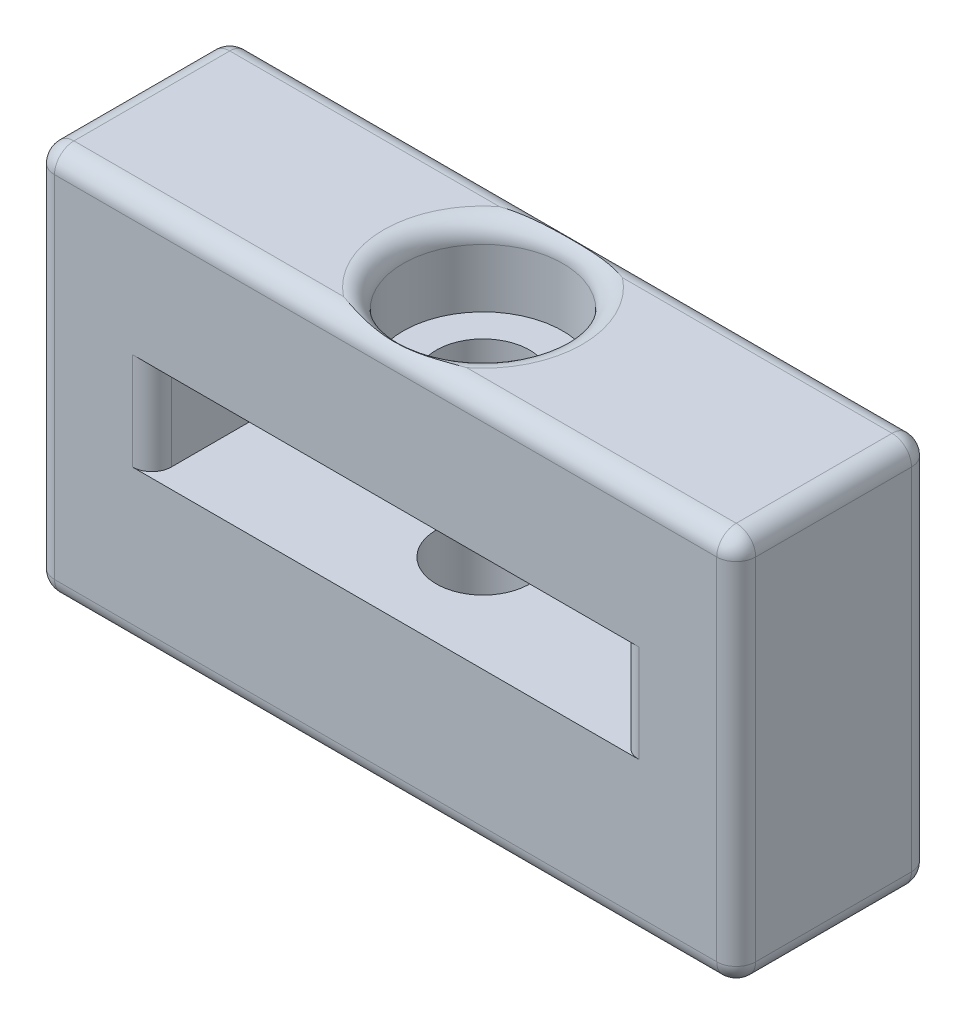
ISO-10303-21;
HEADER;
FILE_DESCRIPTION(('STEP AP214'),'2;1');
FILE_NAME('part.step','',(''),(''),'','','');
FILE_SCHEMA(('AUTOMOTIVE_DESIGN { 1 0 10303 214 1 1 1 1 }'));
ENDSEC;
DATA;
#1=APPLICATION_CONTEXT('core data for automotive mechanical design processes');
#2=APPLICATION_PROTOCOL_DEFINITION('international standard','automotive_design',2000,#1);
#3=PRODUCT_CONTEXT('',#1,'mechanical');
#4=PRODUCT('Part','Part','',(#3));
#5=PRODUCT_RELATED_PRODUCT_CATEGORY('part','',(#4));
#6=PRODUCT_DEFINITION_FORMATION('','',#4);
#7=PRODUCT_DEFINITION_CONTEXT('part definition',#1,'design');
#8=PRODUCT_DEFINITION('design','',#6,#7);
#9=PRODUCT_DEFINITION_SHAPE('','',#8);
#10=(LENGTH_UNIT() NAMED_UNIT(*) SI_UNIT(.MILLI.,.METRE.));
#11=(NAMED_UNIT(*) PLANE_ANGLE_UNIT() SI_UNIT($,.RADIAN.));
#12=(NAMED_UNIT(*) SI_UNIT($,.STERADIAN.) SOLID_ANGLE_UNIT());
#13=UNCERTAINTY_MEASURE_WITH_UNIT(LENGTH_MEASURE(1.E-05),#10,'distance_accuracy_value','');
#14=(GEOMETRIC_REPRESENTATION_CONTEXT(3) GLOBAL_UNCERTAINTY_ASSIGNED_CONTEXT((#13)) GLOBAL_UNIT_ASSIGNED_CONTEXT((#10,
#11,#12)) REPRESENTATION_CONTEXT('',''));
#15=CARTESIAN_POINT('',(0.,0.,0.));
#16=DIRECTION('',(0.,0.,1.));
#17=DIRECTION('',(1.,0.,0.));
#18=AXIS2_PLACEMENT_3D('',#15,#16,#17);
#19=CARTESIAN_POINT('',(0.,10.,0.));
#20=DIRECTION('',(0.,1.,0.));
#21=DIRECTION('',(0.,0.,1.));
#22=AXIS2_PLACEMENT_3D('',#19,#20,#21);
#23=PLANE('',#22);
#24=DIRECTION('',(1.,0.,0.));
#25=VECTOR('',#24,1.);
#26=CARTESIAN_POINT('',(9.,10.,2.));
#27=LINE('',#26,#25);
#28=CARTESIAN_POINT('',(1.58192920195563,10.,2.));
#29=VERTEX_POINT('',#28);
#30=CARTESIAN_POINT('',(8.5,10.,2.));
#31=VERTEX_POINT('',#30);
#32=EDGE_CURVE('E327',#29,#31,#27,.T.);
#33=ORIENTED_EDGE('',*,*,#32,.T.);
#34=DIRECTION('',(0.,0.,-1.));
#35=VECTOR('',#34,1.);
#36=CARTESIAN_POINT('',(8.5,10.,0.));
#37=LINE('',#36,#35);
#38=CARTESIAN_POINT('',(8.5,10.,-2.));
#39=VERTEX_POINT('',#38);
#40=EDGE_CURVE('E330',#31,#39,#37,.T.);
#41=ORIENTED_EDGE('',*,*,#40,.T.);
#42=DIRECTION('',(-1.,0.,0.));
#43=VECTOR('',#42,1.);
#44=CARTESIAN_POINT('',(-9.,10.,-2.));
#45=LINE('',#44,#43);
#46=CARTESIAN_POINT('',(1.58192920195563,10.,-2.));
#47=VERTEX_POINT('',#46);
#48=EDGE_CURVE('E324',#39,#47,#45,.T.);
#49=ORIENTED_EDGE('',*,*,#48,.T.);
#50=CARTESIAN_POINT('',(0.,10.,0.));
#51=DIRECTION('',(0.,1.,0.));
#52=DIRECTION('',(0.,0.,1.));
#53=AXIS2_PLACEMENT_3D('',#50,#51,#52);
#54=CIRCLE('',#53,2.55);
#55=EDGE_CURVE('E321',#47,#29,#54,.F.);
#56=ORIENTED_EDGE('',*,*,#55,.T.);
#57=EDGE_LOOP('',(#33,#41,#49,#56));
#58=FACE_BOUND('',#57,.T.);
#59=ADVANCED_FACE('F45',(#58),#23,.T.);
#60=CARTESIAN_POINT('',(0.,-3.39411254969543,0.));
#61=DIRECTION('',(0.,1.,0.));
#62=DIRECTION('',(0.,0.,1.));
#63=AXIS2_PLACEMENT_3D('',#60,#61,#62);
#64=CYLINDRICAL_SURFACE('',#63,1.2);
#65=CARTESIAN_POINT('',(0.,6.5,0.));
#66=DIRECTION('',(0.,1.,0.));
#67=DIRECTION('',(0.,0.,1.));
#68=AXIS2_PLACEMENT_3D('',#65,#66,#67);
#69=CIRCLE('',#68,1.2);
#70=CARTESIAN_POINT('',(0.,6.5,1.2));
#71=VERTEX_POINT('',#70);
#72=EDGE_CURVE('E502',#71,#71,#69,.T.);
#73=ORIENTED_EDGE('',*,*,#72,.F.);
#74=EDGE_LOOP('',(#73));
#75=FACE_BOUND('',#74,.T.);
#76=CARTESIAN_POINT('',(0.,8.,0.));
#77=DIRECTION('',(0.,1.,0.));
#78=DIRECTION('',(0.,0.,1.));
#79=AXIS2_PLACEMENT_3D('',#76,#77,#78);
#80=CIRCLE('',#79,1.2);
#81=CARTESIAN_POINT('',(0.,8.,1.2));
#82=VERTEX_POINT('',#81);
#83=EDGE_CURVE('E490',#82,#82,#80,.F.);
#84=ORIENTED_EDGE('',*,*,#83,.F.);
#85=EDGE_LOOP('',(#84));
#86=FACE_BOUND('',#85,.T.);
#87=ADVANCED_FACE('F541',(#75,#86),#64,.F.);
#88=CARTESIAN_POINT('',(-6.,4.,-2.5));
#89=DIRECTION('',(0.,0.,1.));
#90=DIRECTION('',(1.,0.,0.));
#91=AXIS2_PLACEMENT_3D('',#88,#89,#90);
#92=PLANE('',#91);
#93=DIRECTION('',(0.,1.,0.));
#94=VECTOR('',#93,1.);
#95=CARTESIAN_POINT('',(-8.5,10.,-2.5));
#96=LINE('',#95,#94);
#97=CARTESIAN_POINT('',(-8.5,0.5,-2.5));
#98=VERTEX_POINT('',#97);
#99=CARTESIAN_POINT('',(-8.5,9.5,-2.5));
#100=VERTEX_POINT('',#99);
#101=EDGE_CURVE('E228',#98,#100,#96,.T.);
#102=ORIENTED_EDGE('',*,*,#101,.T.);
#103=DIRECTION('',(-1.,0.,0.));
#104=VECTOR('',#103,1.);
#105=CARTESIAN_POINT('',(9.,9.5,-2.5));
#106=LINE('',#105,#104);
#107=CARTESIAN_POINT('',(8.5,9.5,-2.5));
#108=VERTEX_POINT('',#107);
#109=EDGE_CURVE('E234',#100,#108,#106,.F.);
#110=ORIENTED_EDGE('',*,*,#109,.T.);
#111=DIRECTION('',(0.,-1.,0.));
#112=VECTOR('',#111,1.);
#113=CARTESIAN_POINT('',(8.5,0.,-2.5));
#114=LINE('',#113,#112);
#115=CARTESIAN_POINT('',(8.5,0.5,-2.5));
#116=VERTEX_POINT('',#115);
#117=EDGE_CURVE('E202',#108,#116,#114,.T.);
#118=ORIENTED_EDGE('',*,*,#117,.T.);
#119=DIRECTION('',(-1.,0.,0.));
#120=VECTOR('',#119,1.);
#121=CARTESIAN_POINT('',(-9.,0.5,-2.5));
#122=LINE('',#121,#120);
#123=EDGE_CURVE('E221',#116,#98,#122,.T.);
#124=ORIENTED_EDGE('',*,*,#123,.T.);
#125=EDGE_LOOP('',(#102,#110,#118,#124));
#126=FACE_BOUND('',#125,.T.);
#127=DIRECTION('',(0.,1.,0.));
#128=VECTOR('',#127,1.);
#129=CARTESIAN_POINT('',(6.5,6.5,-2.5));
#130=LINE('',#129,#128);
#131=CARTESIAN_POINT('',(6.5,4.,-2.5));
#132=VERTEX_POINT('',#131);
#133=CARTESIAN_POINT('',(6.5,6.5,-2.5));
#134=VERTEX_POINT('',#133);
#135=EDGE_CURVE('E247',#132,#134,#130,.T.);
#136=ORIENTED_EDGE('',*,*,#135,.T.);
#137=DIRECTION('',(-1.,0.,0.));
#138=VECTOR('',#137,1.);
#139=CARTESIAN_POINT('',(-9.,6.5,-2.5));
#140=LINE('',#139,#138);
#141=CARTESIAN_POINT('',(-6.5,6.5,-2.5));
#142=VERTEX_POINT('',#141);
#143=EDGE_CURVE('E510',#134,#142,#140,.T.);
#144=ORIENTED_EDGE('',*,*,#143,.T.);
#145=DIRECTION('',(0.,-1.,0.));
#146=VECTOR('',#145,1.);
#147=CARTESIAN_POINT('',(-6.5,4.,-2.5));
#148=LINE('',#147,#146);
#149=CARTESIAN_POINT('',(-6.5,4.,-2.5));
#150=VERTEX_POINT('',#149);
#151=EDGE_CURVE('E240',#142,#150,#148,.T.);
#152=ORIENTED_EDGE('',*,*,#151,.T.);
#153=DIRECTION('',(-1.,0.,0.));
#154=VECTOR('',#153,1.);
#155=CARTESIAN_POINT('',(-6.,4.,-2.5));
#156=LINE('',#155,#154);
#157=EDGE_CURVE('E525',#132,#150,#156,.T.);
#158=ORIENTED_EDGE('',*,*,#157,.F.);
#159=EDGE_LOOP('',(#136,#144,#152,#158));
#160=FACE_BOUND('',#159,.T.);
#161=ADVANCED_FACE('F231',(#126,#160),#92,.F.);
#162=CARTESIAN_POINT('',(-6.,4.,2.5));
#163=DIRECTION('',(0.,0.,-1.));
#164=DIRECTION('',(-1.,0.,0.));
#165=AXIS2_PLACEMENT_3D('',#162,#163,#164);
#166=PLANE('',#165);
#167=DIRECTION('',(0.,1.,0.));
#168=VECTOR('',#167,1.);
#169=CARTESIAN_POINT('',(8.5,10.,2.5));
#170=LINE('',#169,#168);
#171=CARTESIAN_POINT('',(8.5,0.5,2.5));
#172=VERTEX_POINT('',#171);
#173=CARTESIAN_POINT('',(8.5,9.5,2.5));
#174=VERTEX_POINT('',#173);
#175=EDGE_CURVE('E290',#172,#174,#170,.T.);
#176=ORIENTED_EDGE('',*,*,#175,.T.);
#177=DIRECTION('',(1.,0.,0.));
#178=VECTOR('',#177,1.);
#179=CARTESIAN_POINT('',(-9.,9.5,2.5));
#180=LINE('',#179,#178);
#181=CARTESIAN_POINT('',(-8.5,9.5,2.5));
#182=VERTEX_POINT('',#181);
#183=EDGE_CURVE('E297',#174,#182,#180,.F.);
#184=ORIENTED_EDGE('',*,*,#183,.T.);
#185=DIRECTION('',(0.,-1.,0.));
#186=VECTOR('',#185,1.);
#187=CARTESIAN_POINT('',(-8.5,0.,2.5));
#188=LINE('',#187,#186);
#189=CARTESIAN_POINT('',(-8.5,0.5,2.5));
#190=VERTEX_POINT('',#189);
#191=EDGE_CURVE('E293',#182,#190,#188,.T.);
#192=ORIENTED_EDGE('',*,*,#191,.T.);
#193=DIRECTION('',(1.,0.,0.));
#194=VECTOR('',#193,1.);
#195=CARTESIAN_POINT('',(9.,0.5,2.5));
#196=LINE('',#195,#194);
#197=EDGE_CURVE('E287',#190,#172,#196,.T.);
#198=ORIENTED_EDGE('',*,*,#197,.T.);
#199=EDGE_LOOP('',(#176,#184,#192,#198));
#200=FACE_BOUND('',#199,.T.);
#201=DIRECTION('',(0.,1.,0.));
#202=VECTOR('',#201,1.);
#203=CARTESIAN_POINT('',(-6.5,6.5,2.5));
#204=LINE('',#203,#202);
#205=CARTESIAN_POINT('',(-6.5,4.,2.5));
#206=VERTEX_POINT('',#205);
#207=CARTESIAN_POINT('',(-6.5,6.5,2.5));
#208=VERTEX_POINT('',#207);
#209=EDGE_CURVE('E304',#206,#208,#204,.T.);
#210=ORIENTED_EDGE('',*,*,#209,.T.);
#211=DIRECTION('',(1.,0.,0.));
#212=VECTOR('',#211,1.);
#213=CARTESIAN_POINT('',(-9.,6.5,2.5));
#214=LINE('',#213,#212);
#215=CARTESIAN_POINT('',(6.5,6.5,2.5));
#216=VERTEX_POINT('',#215);
#217=EDGE_CURVE('E507',#208,#216,#214,.T.);
#218=ORIENTED_EDGE('',*,*,#217,.T.);
#219=DIRECTION('',(0.,-1.,0.));
#220=VECTOR('',#219,1.);
#221=CARTESIAN_POINT('',(6.5,4.,2.5));
#222=LINE('',#221,#220);
#223=CARTESIAN_POINT('',(6.5,4.,2.5));
#224=VERTEX_POINT('',#223);
#225=EDGE_CURVE('E300',#216,#224,#222,.T.);
#226=ORIENTED_EDGE('',*,*,#225,.T.);
#227=DIRECTION('',(1.,0.,0.));
#228=VECTOR('',#227,1.);
#229=CARTESIAN_POINT('',(-6.,4.,2.5));
#230=LINE('',#229,#228);
#231=EDGE_CURVE('E229',#206,#224,#230,.T.);
#232=ORIENTED_EDGE('',*,*,#231,.F.);
#233=EDGE_LOOP('',(#210,#218,#226,#232));
#234=FACE_BOUND('',#233,.T.);
#235=ADVANCED_FACE('F640',(#200,#234),#166,.F.);
#236=CARTESIAN_POINT('',(0.,4.,0.));
#237=DIRECTION('',(0.,-1.,0.));
#238=DIRECTION('',(0.,0.,-1.));
#239=AXIS2_PLACEMENT_3D('',#236,#237,#238);
#240=PLANE('',#239);
#241=CARTESIAN_POINT('',(0.,4.,0.));
#242=DIRECTION('',(0.,-1.,0.));
#243=DIRECTION('',(0.,0.,-1.));
#244=AXIS2_PLACEMENT_3D('',#241,#242,#243);
#245=CIRCLE('',#244,1.2);
#246=CARTESIAN_POINT('',(0.,4.,-1.2));
#247=VERTEX_POINT('',#246);
#248=EDGE_CURVE('E503',#247,#247,#245,.T.);
#249=ORIENTED_EDGE('',*,*,#248,.T.);
#250=EDGE_LOOP('',(#249));
#251=FACE_BOUND('',#250,.T.);
#252=ORIENTED_EDGE('',*,*,#231,.T.);
#253=CARTESIAN_POINT('',(6.5,4.,2.));
#254=DIRECTION('',(0.,-1.,0.));
#255=DIRECTION('',(0.,0.,-1.));
#256=AXIS2_PLACEMENT_3D('',#253,#254,#255);
#257=CIRCLE('',#256,0.5);
#258=CARTESIAN_POINT('',(6.,4.,2.));
#259=VERTEX_POINT('',#258);
#260=EDGE_CURVE('E55',#224,#259,#257,.T.);
#261=ORIENTED_EDGE('',*,*,#260,.T.);
#262=DIRECTION('',(0.,0.,-1.));
#263=VECTOR('',#262,1.);
#264=CARTESIAN_POINT('',(6.,4.,2.5));
#265=LINE('',#264,#263);
#266=CARTESIAN_POINT('',(6.,4.,-2.));
#267=VERTEX_POINT('',#266);
#268=EDGE_CURVE('E518',#259,#267,#265,.T.);
#269=ORIENTED_EDGE('',*,*,#268,.T.);
#270=CARTESIAN_POINT('',(6.5,4.,-2.));
#271=DIRECTION('',(0.,-1.,0.));
#272=DIRECTION('',(0.,0.,-1.));
#273=AXIS2_PLACEMENT_3D('',#270,#271,#272);
#274=CIRCLE('',#273,0.5);
#275=EDGE_CURVE('E351',#267,#132,#274,.T.);
#276=ORIENTED_EDGE('',*,*,#275,.T.);
#277=ORIENTED_EDGE('',*,*,#157,.T.);
#278=CARTESIAN_POINT('',(-6.5,4.,-2.));
#279=DIRECTION('',(0.,-1.,0.));
#280=DIRECTION('',(0.,0.,-1.));
#281=AXIS2_PLACEMENT_3D('',#278,#279,#280);
#282=CIRCLE('',#281,0.5);
#283=CARTESIAN_POINT('',(-6.,4.,-2.));
#284=VERTEX_POINT('',#283);
#285=EDGE_CURVE('E355',#150,#284,#282,.T.);
#286=ORIENTED_EDGE('',*,*,#285,.T.);
#287=DIRECTION('',(0.,0.,1.));
#288=VECTOR('',#287,1.);
#289=CARTESIAN_POINT('',(-6.,4.,2.5));
#290=LINE('',#289,#288);
#291=CARTESIAN_POINT('',(-6.,4.,2.));
#292=VERTEX_POINT('',#291);
#293=EDGE_CURVE('E528',#284,#292,#290,.T.);
#294=ORIENTED_EDGE('',*,*,#293,.T.);
#295=CARTESIAN_POINT('',(-6.5,4.,2.));
#296=DIRECTION('',(0.,-1.,0.));
#297=DIRECTION('',(0.,0.,-1.));
#298=AXIS2_PLACEMENT_3D('',#295,#296,#297);
#299=CIRCLE('',#298,0.5);
#300=EDGE_CURVE('E365',#292,#206,#299,.T.);
#301=ORIENTED_EDGE('',*,*,#300,.T.);
#302=EDGE_LOOP('',(#252,#261,#269,#276,#277,#286,#294,#301));
#303=FACE_BOUND('',#302,.T.);
#304=ADVANCED_FACE('F687',(#251,#303),#240,.F.);
#305=CARTESIAN_POINT('',(0.,0.,0.));
#306=DIRECTION('',(0.,-1.,0.));
#307=DIRECTION('',(0.,0.,-1.));
#308=AXIS2_PLACEMENT_3D('',#305,#306,#307);
#309=PLANE('',#308);
#310=DIRECTION('',(-1.,0.,0.));
#311=VECTOR('',#310,1.);
#312=CARTESIAN_POINT('',(9.,0.,-2.));
#313=LINE('',#312,#311);
#314=CARTESIAN_POINT('',(-8.5,0.,-2.));
#315=VERTEX_POINT('',#314);
#316=CARTESIAN_POINT('',(8.5,0.,-2.));
#317=VERTEX_POINT('',#316);
#318=EDGE_CURVE('E63',#315,#317,#313,.F.);
#319=ORIENTED_EDGE('',*,*,#318,.T.);
#320=DIRECTION('',(0.,0.,1.));
#321=VECTOR('',#320,1.);
#322=CARTESIAN_POINT('',(8.5,0.,0.));
#323=LINE('',#322,#321);
#324=CARTESIAN_POINT('',(8.5,0.,2.));
#325=VERTEX_POINT('',#324);
#326=EDGE_CURVE('E345',#317,#325,#323,.T.);
#327=ORIENTED_EDGE('',*,*,#326,.T.);
#328=DIRECTION('',(1.,0.,0.));
#329=VECTOR('',#328,1.);
#330=CARTESIAN_POINT('',(-9.,0.,2.));
#331=LINE('',#330,#329);
#332=CARTESIAN_POINT('',(-8.5,0.,2.));
#333=VERTEX_POINT('',#332);
#334=EDGE_CURVE('E338',#325,#333,#331,.F.);
#335=ORIENTED_EDGE('',*,*,#334,.T.);
#336=DIRECTION('',(0.,0.,1.));
#337=VECTOR('',#336,1.);
#338=CARTESIAN_POINT('',(-8.5,0.,0.));
#339=LINE('',#338,#337);
#340=EDGE_CURVE('E68',#333,#315,#339,.F.);
#341=ORIENTED_EDGE('',*,*,#340,.T.);
#342=EDGE_LOOP('',(#319,#327,#335,#341));
#343=FACE_BOUND('',#342,.T.);
#344=CARTESIAN_POINT('',(0.,0.,0.));
#345=DIRECTION('',(0.,-1.,0.));
#346=DIRECTION('',(0.,0.,-1.));
#347=AXIS2_PLACEMENT_3D('',#344,#345,#346);
#348=CIRCLE('',#347,1.2);
#349=CARTESIAN_POINT('',(0.,0.,-1.2));
#350=VERTEX_POINT('',#349);
#351=EDGE_CURVE('E496',#350,#350,#348,.F.);
#352=ORIENTED_EDGE('',*,*,#351,.T.);
#353=EDGE_LOOP('',(#352));
#354=FACE_BOUND('',#353,.T.);
#355=ADVANCED_FACE('F607',(#343,#354),#309,.T.);
#356=CARTESIAN_POINT('',(-6.,0.,-9.65891053163818));
#357=DIRECTION('',(1.,0.,0.));
#358=DIRECTION('',(0.,0.,-1.));
#359=AXIS2_PLACEMENT_3D('',#356,#357,#358);
#360=PLANE('',#359);
#361=ORIENTED_EDGE('',*,*,#293,.F.);
#362=DIRECTION('',(0.,-1.,0.));
#363=VECTOR('',#362,1.);
#364=CARTESIAN_POINT('',(-6.,6.5,-2.));
#365=LINE('',#364,#363);
#366=CARTESIAN_POINT('',(-6.,6.5,-2.));
#367=VERTEX_POINT('',#366);
#368=EDGE_CURVE('E271',#284,#367,#365,.F.);
#369=ORIENTED_EDGE('',*,*,#368,.T.);
#370=DIRECTION('',(0.,0.,1.));
#371=VECTOR('',#370,1.);
#372=CARTESIAN_POINT('',(-6.,6.5,-9.65891053163818));
#373=LINE('',#372,#371);
#374=CARTESIAN_POINT('',(-6.,6.5,2.));
#375=VERTEX_POINT('',#374);
#376=EDGE_CURVE('E514',#367,#375,#373,.T.);
#377=ORIENTED_EDGE('',*,*,#376,.T.);
#378=DIRECTION('',(0.,1.,0.));
#379=VECTOR('',#378,1.);
#380=CARTESIAN_POINT('',(-6.,4.,2.));
#381=LINE('',#380,#379);
#382=EDGE_CURVE('E268',#375,#292,#381,.F.);
#383=ORIENTED_EDGE('',*,*,#382,.T.);
#384=EDGE_LOOP('',(#361,#369,#377,#383));
#385=FACE_BOUND('',#384,.T.);
#386=ADVANCED_FACE('F693',(#385),#360,.T.);
#387=CARTESIAN_POINT('',(-9.,0.,-9.65891053163818));
#388=DIRECTION('',(-1.,0.,0.));
#389=DIRECTION('',(0.,0.,1.));
#390=AXIS2_PLACEMENT_3D('',#387,#388,#389);
#391=PLANE('',#390);
#392=DIRECTION('',(0.,-1.,0.));
#393=VECTOR('',#392,1.);
#394=CARTESIAN_POINT('',(-9.,10.,2.));
#395=LINE('',#394,#393);
#396=CARTESIAN_POINT('',(-9.,0.5,2.));
#397=VERTEX_POINT('',#396);
#398=CARTESIAN_POINT('',(-9.,9.5,2.));
#399=VERTEX_POINT('',#398);
#400=EDGE_CURVE('E277',#397,#399,#395,.F.);
#401=ORIENTED_EDGE('',*,*,#400,.T.);
#402=DIRECTION('',(0.,0.,1.));
#403=VECTOR('',#402,1.);
#404=CARTESIAN_POINT('',(-9.,9.5,-9.65891053163818));
#405=LINE('',#404,#403);
#406=CARTESIAN_POINT('',(-9.,9.5,-2.));
#407=VERTEX_POINT('',#406);
#408=EDGE_CURVE('E284',#399,#407,#405,.F.);
#409=ORIENTED_EDGE('',*,*,#408,.T.);
#410=DIRECTION('',(0.,1.,0.));
#411=VECTOR('',#410,1.);
#412=CARTESIAN_POINT('',(-9.,0.,-2.));
#413=LINE('',#412,#411);
#414=CARTESIAN_POINT('',(-9.,0.5,-2.));
#415=VERTEX_POINT('',#414);
#416=EDGE_CURVE('E280',#407,#415,#413,.F.);
#417=ORIENTED_EDGE('',*,*,#416,.T.);
#418=DIRECTION('',(0.,0.,1.));
#419=VECTOR('',#418,1.);
#420=CARTESIAN_POINT('',(-9.,0.5,-9.65891053163818));
#421=LINE('',#420,#419);
#422=EDGE_CURVE('E274',#415,#397,#421,.T.);
#423=ORIENTED_EDGE('',*,*,#422,.T.);
#424=EDGE_LOOP('',(#401,#409,#417,#423));
#425=FACE_BOUND('',#424,.T.);
#426=ADVANCED_FACE('F648',(#425),#391,.T.);
#427=CARTESIAN_POINT('',(6.,0.,-9.65891053163818));
#428=DIRECTION('',(-1.,0.,0.));
#429=DIRECTION('',(0.,-1.,0.));
#430=AXIS2_PLACEMENT_3D('',#427,#428,#429);
#431=PLANE('',#430);
#432=DIRECTION('',(0.,0.,1.));
#433=VECTOR('',#432,1.);
#434=CARTESIAN_POINT('',(6.,6.5,-9.65891053163818));
#435=LINE('',#434,#433);
#436=CARTESIAN_POINT('',(6.,6.5,-2.));
#437=VERTEX_POINT('',#436);
#438=CARTESIAN_POINT('',(6.,6.5,2.));
#439=VERTEX_POINT('',#438);
#440=EDGE_CURVE('E513',#437,#439,#435,.T.);
#441=ORIENTED_EDGE('',*,*,#440,.F.);
#442=DIRECTION('',(0.,1.,0.));
#443=VECTOR('',#442,1.);
#444=CARTESIAN_POINT('',(6.,4.,-2.));
#445=LINE('',#444,#443);
#446=EDGE_CURVE('E265',#437,#267,#445,.F.);
#447=ORIENTED_EDGE('',*,*,#446,.T.);
#448=ORIENTED_EDGE('',*,*,#268,.F.);
#449=DIRECTION('',(0.,-1.,0.));
#450=VECTOR('',#449,1.);
#451=CARTESIAN_POINT('',(6.,6.5,2.));
#452=LINE('',#451,#450);
#453=EDGE_CURVE('E262',#259,#439,#452,.F.);
#454=ORIENTED_EDGE('',*,*,#453,.T.);
#455=EDGE_LOOP('',(#441,#447,#448,#454));
#456=FACE_BOUND('',#455,.T.);
#457=ADVANCED_FACE('F575',(#456),#431,.T.);
#458=CARTESIAN_POINT('',(9.,6.5,-9.65891053163818));
#459=DIRECTION('',(1.,0.,0.));
#460=DIRECTION('',(0.,1.,0.));
#461=AXIS2_PLACEMENT_3D('',#458,#459,#460);
#462=PLANE('',#461);
#463=DIRECTION('',(0.,-1.,0.));
#464=VECTOR('',#463,1.);
#465=CARTESIAN_POINT('',(9.,10.,-2.));
#466=LINE('',#465,#464);
#467=CARTESIAN_POINT('',(9.,0.5,-2.));
#468=VERTEX_POINT('',#467);
#469=CARTESIAN_POINT('',(9.,9.5,-2.));
#470=VERTEX_POINT('',#469);
#471=EDGE_CURVE('E204',#468,#470,#466,.F.);
#472=ORIENTED_EDGE('',*,*,#471,.T.);
#473=DIRECTION('',(0.,0.,-1.));
#474=VECTOR('',#473,1.);
#475=CARTESIAN_POINT('',(9.,9.5,-9.65891053163818));
#476=LINE('',#475,#474);
#477=CARTESIAN_POINT('',(9.,9.5,2.));
#478=VERTEX_POINT('',#477);
#479=EDGE_CURVE('E259',#470,#478,#476,.F.);
#480=ORIENTED_EDGE('',*,*,#479,.T.);
#481=DIRECTION('',(0.,1.,0.));
#482=VECTOR('',#481,1.);
#483=CARTESIAN_POINT('',(9.,0.,2.));
#484=LINE('',#483,#482);
#485=CARTESIAN_POINT('',(9.,0.5,2.));
#486=VERTEX_POINT('',#485);
#487=EDGE_CURVE('E254',#478,#486,#484,.F.);
#488=ORIENTED_EDGE('',*,*,#487,.T.);
#489=DIRECTION('',(0.,0.,1.));
#490=VECTOR('',#489,1.);
#491=CARTESIAN_POINT('',(9.,0.5,-9.65891053163818));
#492=LINE('',#491,#490);
#493=EDGE_CURVE('E251',#486,#468,#492,.F.);
#494=ORIENTED_EDGE('',*,*,#493,.T.);
#495=EDGE_LOOP('',(#472,#480,#488,#494));
#496=FACE_BOUND('',#495,.T.);
#497=ADVANCED_FACE('F569',(#496),#462,.T.);
#498=DIRECTION('',(-1.,0.,0.));
#499=VECTOR('',#498,1.);
#500=CARTESIAN_POINT('',(-9.,10.,-2.));
#501=LINE('',#500,#499);
#502=CARTESIAN_POINT('',(-1.58192920195564,10.,-2.));
#503=VERTEX_POINT('',#502);
#504=CARTESIAN_POINT('',(-8.5,10.,-2.));
#505=VERTEX_POINT('',#504);
#506=EDGE_CURVE('E311',#503,#505,#501,.T.);
#507=ORIENTED_EDGE('',*,*,#506,.T.);
#508=DIRECTION('',(0.,0.,1.));
#509=VECTOR('',#508,1.);
#510=CARTESIAN_POINT('',(-8.5,10.,0.));
#511=LINE('',#510,#509);
#512=CARTESIAN_POINT('',(-8.5,10.,2.));
#513=VERTEX_POINT('',#512);
#514=EDGE_CURVE('E317',#505,#513,#511,.T.);
#515=ORIENTED_EDGE('',*,*,#514,.T.);
#516=DIRECTION('',(1.,0.,0.));
#517=VECTOR('',#516,1.);
#518=CARTESIAN_POINT('',(9.,10.,2.));
#519=LINE('',#518,#517);
#520=CARTESIAN_POINT('',(-1.58192920195564,10.,2.));
#521=VERTEX_POINT('',#520);
#522=EDGE_CURVE('E314',#513,#521,#519,.T.);
#523=ORIENTED_EDGE('',*,*,#522,.T.);
#524=CARTESIAN_POINT('',(0.,10.,0.));
#525=DIRECTION('',(0.,1.,0.));
#526=DIRECTION('',(0.,0.,1.));
#527=AXIS2_PLACEMENT_3D('',#524,#525,#526);
#528=CIRCLE('',#527,2.55);
#529=EDGE_CURVE('E308',#521,#503,#528,.F.);
#530=ORIENTED_EDGE('',*,*,#529,.T.);
#531=EDGE_LOOP('',(#507,#515,#523,#530));
#532=FACE_BOUND('',#531,.T.);
#533=ADVANCED_FACE('F563',(#532),#23,.T.);
#534=CARTESIAN_POINT('',(0.,6.5,0.));
#535=DIRECTION('',(0.,1.,0.));
#536=DIRECTION('',(0.,0.,1.));
#537=AXIS2_PLACEMENT_3D('',#534,#535,#536);
#538=PLANE('',#537);
#539=ORIENTED_EDGE('',*,*,#72,.T.);
#540=EDGE_LOOP('',(#539));
#541=FACE_BOUND('',#540,.T.);
#542=ORIENTED_EDGE('',*,*,#376,.F.);
#543=CARTESIAN_POINT('',(-6.5,6.5,-2.));
#544=DIRECTION('',(0.,1.,0.));
#545=DIRECTION('',(0.,0.,1.));
#546=AXIS2_PLACEMENT_3D('',#543,#544,#545);
#547=CIRCLE('',#546,0.5);
#548=EDGE_CURVE('E358',#367,#142,#547,.T.);
#549=ORIENTED_EDGE('',*,*,#548,.T.);
#550=ORIENTED_EDGE('',*,*,#143,.F.);
#551=CARTESIAN_POINT('',(6.5,6.5,-2.));
#552=DIRECTION('',(0.,1.,0.));
#553=DIRECTION('',(0.,0.,1.));
#554=AXIS2_PLACEMENT_3D('',#551,#552,#553);
#555=CIRCLE('',#554,0.5);
#556=EDGE_CURVE('E348',#134,#437,#555,.T.);
#557=ORIENTED_EDGE('',*,*,#556,.T.);
#558=ORIENTED_EDGE('',*,*,#440,.T.);
#559=CARTESIAN_POINT('',(6.5,6.5,2.));
#560=DIRECTION('',(0.,1.,0.));
#561=DIRECTION('',(0.,0.,1.));
#562=AXIS2_PLACEMENT_3D('',#559,#560,#561);
#563=CIRCLE('',#562,0.5);
#564=EDGE_CURVE('E11',#439,#216,#563,.T.);
#565=ORIENTED_EDGE('',*,*,#564,.T.);
#566=ORIENTED_EDGE('',*,*,#217,.F.);
#567=CARTESIAN_POINT('',(-6.5,6.5,2.));
#568=DIRECTION('',(0.,1.,0.));
#569=DIRECTION('',(0.,0.,1.));
#570=AXIS2_PLACEMENT_3D('',#567,#568,#569);
#571=CIRCLE('',#570,0.5);
#572=EDGE_CURVE('E362',#208,#375,#571,.T.);
#573=ORIENTED_EDGE('',*,*,#572,.T.);
#574=EDGE_LOOP('',(#542,#549,#550,#557,#558,#565,#566,#573));
#575=FACE_BOUND('',#574,.T.);
#576=ADVANCED_FACE('F538',(#541,#575),#538,.F.);
#577=ORIENTED_EDGE('',*,*,#351,.F.);
#578=EDGE_LOOP('',(#577));
#579=FACE_BOUND('',#578,.T.);
#580=ORIENTED_EDGE('',*,*,#248,.F.);
#581=EDGE_LOOP('',(#580));
#582=FACE_BOUND('',#581,.T.);
#583=ADVANCED_FACE('F545',(#579,#582),#64,.F.);
#584=CARTESIAN_POINT('',(0.,8.,0.));
#585=DIRECTION('',(0.,1.,0.));
#586=DIRECTION('',(0.,0.,1.));
#587=AXIS2_PLACEMENT_3D('',#584,#585,#586);
#588=PLANE('',#587);
#589=CARTESIAN_POINT('',(0.,8.,0.));
#590=DIRECTION('',(0.,1.,0.));
#591=DIRECTION('',(0.,0.,1.));
#592=AXIS2_PLACEMENT_3D('',#589,#590,#591);
#593=CIRCLE('',#592,2.05);
#594=CARTESIAN_POINT('',(0.,8.,2.05));
#595=VERTEX_POINT('',#594);
#596=EDGE_CURVE('E483',#595,#595,#593,.T.);
#597=ORIENTED_EDGE('',*,*,#596,.T.);
#598=EDGE_LOOP('',(#597));
#599=FACE_BOUND('',#598,.T.);
#600=ORIENTED_EDGE('',*,*,#83,.T.);
#601=EDGE_LOOP('',(#600));
#602=FACE_BOUND('',#601,.T.);
#603=ADVANCED_FACE('F548',(#599,#602),#588,.T.);
#604=CARTESIAN_POINT('',(0.,8.,0.));
#605=DIRECTION('',(0.,1.,0.));
#606=DIRECTION('',(0.,0.,1.));
#607=AXIS2_PLACEMENT_3D('',#604,#605,#606);
#608=CYLINDRICAL_SURFACE('',#607,2.05);
#609=CARTESIAN_POINT('',(0.,9.5,0.));
#610=DIRECTION('',(0.,1.,0.));
#611=DIRECTION('',(0.,0.,1.));
#612=AXIS2_PLACEMENT_3D('',#609,#610,#611);
#613=CIRCLE('',#612,2.05);
#614=CARTESIAN_POINT('',(0.,9.5,2.05));
#615=VERTEX_POINT('',#614);
#616=EDGE_CURVE('E334',#615,#615,#613,.T.);
#617=ORIENTED_EDGE('',*,*,#616,.T.);
#618=EDGE_LOOP('',(#617));
#619=FACE_BOUND('',#618,.T.);
#620=ORIENTED_EDGE('',*,*,#596,.F.);
#621=EDGE_LOOP('',(#620));
#622=FACE_BOUND('',#621,.T.);
#623=ADVANCED_FACE('F550',(#619,#622),#608,.F.);
#624=CARTESIAN_POINT('',(-8.5,4.,2.));
#625=DIRECTION('',(0.,1.,0.));
#626=DIRECTION('',(0.,0.,1.));
#627=AXIS2_PLACEMENT_3D('',#624,#625,#626);
#628=CYLINDRICAL_SURFACE('',#627,0.5);
#629=CARTESIAN_POINT('',(-8.5,9.5,2.));
#630=DIRECTION('',(0.,1.,0.));
#631=DIRECTION('',(0.,0.,1.));
#632=AXIS2_PLACEMENT_3D('',#629,#630,#631);
#633=CIRCLE('',#632,0.5);
#634=EDGE_CURVE('E49',#399,#182,#633,.T.);
#635=ORIENTED_EDGE('',*,*,#634,.F.);
#636=ORIENTED_EDGE('',*,*,#400,.F.);
#637=CARTESIAN_POINT('',(-8.5,0.5,2.));
#638=DIRECTION('',(0.,-1.,0.));
#639=DIRECTION('',(0.,0.,-1.));
#640=AXIS2_PLACEMENT_3D('',#637,#638,#639);
#641=CIRCLE('',#640,0.5);
#642=EDGE_CURVE('E474',#190,#397,#641,.T.);
#643=ORIENTED_EDGE('',*,*,#642,.F.);
#644=ORIENTED_EDGE('',*,*,#191,.F.);
#645=EDGE_LOOP('',(#635,#636,#643,#644));
#646=FACE_BOUND('',#645,.T.);
#647=ADVANCED_FACE('F556',(#646),#628,.T.);
#648=CARTESIAN_POINT('',(-8.5,9.5,2.));
#649=DIRECTION('',(0.,0.,1.));
#650=DIRECTION('',(1.,0.,0.));
#651=AXIS2_PLACEMENT_3D('',#648,#649,#650);
#652=SPHERICAL_SURFACE('',#651,0.5);
#653=CARTESIAN_POINT('',(-8.5,9.5,2.));
#654=DIRECTION('',(0.,0.,1.));
#655=DIRECTION('',(1.,0.,0.));
#656=AXIS2_PLACEMENT_3D('',#653,#654,#655);
#657=CIRCLE('',#656,0.5);
#658=EDGE_CURVE('E467',#399,#513,#657,.F.);
#659=ORIENTED_EDGE('',*,*,#658,.F.);
#660=ORIENTED_EDGE('',*,*,#634,.T.);
#661=CARTESIAN_POINT('',(-8.5,9.5,2.));
#662=DIRECTION('',(-1.,0.,0.));
#663=DIRECTION('',(0.,0.,1.));
#664=AXIS2_PLACEMENT_3D('',#661,#662,#663);
#665=CIRCLE('',#664,0.5);
#666=EDGE_CURVE('E471',#513,#182,#665,.F.);
#667=ORIENTED_EDGE('',*,*,#666,.F.);
#668=EDGE_LOOP('',(#659,#660,#667));
#669=FACE_BOUND('',#668,.T.);
#670=ADVANCED_FACE('F646',(#669),#652,.T.);
#671=CARTESIAN_POINT('',(-8.5,0.5,2.));
#672=DIRECTION('',(-1.,0.,0.));
#673=DIRECTION('',(0.,0.,1.));
#674=AXIS2_PLACEMENT_3D('',#671,#672,#673);
#675=SPHERICAL_SURFACE('',#674,0.5);
#676=CARTESIAN_POINT('',(-8.5,0.5,2.));
#677=DIRECTION('',(-1.,0.,0.));
#678=DIRECTION('',(0.,0.,1.));
#679=AXIS2_PLACEMENT_3D('',#676,#677,#678);
#680=CIRCLE('',#679,0.5);
#681=EDGE_CURVE('E459',#190,#333,#680,.F.);
#682=ORIENTED_EDGE('',*,*,#681,.F.);
#683=ORIENTED_EDGE('',*,*,#642,.T.);
#684=CARTESIAN_POINT('',(-8.5,0.5,2.));
#685=DIRECTION('',(0.,0.,1.));
#686=DIRECTION('',(1.,0.,0.));
#687=AXIS2_PLACEMENT_3D('',#684,#685,#686);
#688=CIRCLE('',#687,0.5);
#689=EDGE_CURVE('E463',#333,#397,#688,.F.);
#690=ORIENTED_EDGE('',*,*,#689,.F.);
#691=EDGE_LOOP('',(#682,#683,#690));
#692=FACE_BOUND('',#691,.T.);
#693=ADVANCED_FACE('F435',(#692),#675,.T.);
#694=CARTESIAN_POINT('',(0.,9.5,2.));
#695=DIRECTION('',(-1.,0.,0.));
#696=DIRECTION('',(0.,0.,1.));
#697=AXIS2_PLACEMENT_3D('',#694,#695,#696);
#698=CYLINDRICAL_SURFACE('',#697,0.5);
#699=ORIENTED_EDGE('',*,*,#666,.T.);
#700=ORIENTED_EDGE('',*,*,#183,.F.);
#701=CARTESIAN_POINT('',(8.5,9.5,2.));
#702=DIRECTION('',(1.,0.,0.));
#703=DIRECTION('',(0.,0.,-1.));
#704=AXIS2_PLACEMENT_3D('',#701,#702,#703);
#705=CIRCLE('',#704,0.5);
#706=EDGE_CURVE('E449',#31,#174,#705,.T.);
#707=ORIENTED_EDGE('',*,*,#706,.F.);
#708=ORIENTED_EDGE('',*,*,#32,.F.);
#709=CARTESIAN_POINT('',(1.58192920195563,10.,2.));
#710=CARTESIAN_POINT('',(1.58014152509057,9.99999999309181,2.00062153530912));
#711=CARTESIAN_POINT('',(1.57835351288523,9.99999883450169,2.00124213194667));
#712=CARTESIAN_POINT('',(1.49726573982739,9.99989451260117,2.02933879839615));
#713=CARTESIAN_POINT('',(1.41731043678907,9.9975467052657,2.05496700429935));
#714=CARTESIAN_POINT('',(1.25635435538128,9.99001591353063,2.10225918367549));
#715=CARTESIAN_POINT('',(1.17535304403257,9.98483142320481,2.12392104335194));
#716=CARTESIAN_POINT('',(1.01230468865968,9.97308675190225,2.16312036647907));
#717=CARTESIAN_POINT('',(0.930256052643991,9.96652416146397,2.18065049056882));
#718=CARTESIAN_POINT('',(0.765349948318146,9.95342887357366,2.21137809677538));
#719=CARTESIAN_POINT('',(0.682492454801714,9.9468961770626,2.22457544342395));
#720=CARTESIAN_POINT('',(0.487983603925786,9.93322657228573,2.25019208335966));
#721=CARTESIAN_POINT('',(0.37605096597977,9.92662966987602,2.26084600099945));
#722=CARTESIAN_POINT('',(0.151523383238716,9.91840792951501,2.27386088415493));
#723=CARTESIAN_POINT('',(0.0389285931529889,9.91678197301808,2.27622371532089));
#724=CARTESIAN_POINT('',(-0.186078566260702,9.9191649685227,2.27258655255011));
#725=CARTESIAN_POINT('',(-0.298490893927235,9.92317506423308,2.26658486122553));
#726=CARTESIAN_POINT('',(-0.52235905734148,9.93522649894694,2.24639345534852));
#727=CARTESIAN_POINT('',(-0.633814658672886,9.94326879876981,2.23220178911468));
#728=CARTESIAN_POINT('',(-0.815269053306099,9.9573311620692,2.20250997314759));
#729=CARTESIAN_POINT('',(-0.88568763584088,9.96303112519085,2.18933790567616));
#730=CARTESIAN_POINT('',(-1.02589908645141,9.97400897886181,2.15988386521696));
#731=CARTESIAN_POINT('',(-1.09569204669555,9.9792869325212,2.14360235847398));
#732=CARTESIAN_POINT('',(-1.2344663689695,9.98852663594093,2.10806587069057));
#733=CARTESIAN_POINT('',(-1.303448997443,9.99249081165189,2.08881646744604));
#734=CARTESIAN_POINT('',(-1.44063509165732,9.99818176615107,2.0474474076258));
#735=CARTESIAN_POINT('',(-1.50883882579938,9.99990934022138,2.02532877435928));
#736=CARTESIAN_POINT('',(-1.5783535122061,9.99999883611684,2.00124213181086));
#737=CARTESIAN_POINT('',(-1.58014152443466,9.99999999474902,2.00062153515047));
#738=CARTESIAN_POINT('',(-1.58192920195564,10.,2.));
#739=B_SPLINE_CURVE_WITH_KNOTS('',3,(#709,#710,#711,#712,#713,#714,#715,#716,#717,#718,#719,
#720,#721,#722,#723,#724,#725,#726,#727,#728,#729,#730,#731,#732,#733,#734,#735,#736,#737,#738),
.UNSPECIFIED.,.F.,.F.,(4,2,2,2,2,2,2,2,2,2,2,2,2,2,4),(0.,0.00567795187876392,0.25745159589806,
0.509359030308458,0.761710620801143,1.01407010054545,1.35158846004158,1.68903086669214,
2.02654175950507,2.36413311482362,2.57967158016762,2.7951777519417,3.01028373527746,
3.22531321103876,3.23099116292096),.UNSPECIFIED.);
#740=EDGE_CURVE('E440',#521,#29,#739,.F.);
#741=ORIENTED_EDGE('',*,*,#740,.F.);
#742=ORIENTED_EDGE('',*,*,#522,.F.);
#743=EDGE_LOOP('',(#699,#700,#707,#708,#741,#742));
#744=FACE_BOUND('',#743,.T.);
#745=ADVANCED_FACE('F430',(#744),#698,.T.);
#746=CARTESIAN_POINT('',(-8.5,9.5,0.));
#747=DIRECTION('',(0.,0.,1.));
#748=DIRECTION('',(1.,0.,0.));
#749=AXIS2_PLACEMENT_3D('',#746,#747,#748);
#750=CYLINDRICAL_SURFACE('',#749,0.5);
#751=ORIENTED_EDGE('',*,*,#658,.T.);
#752=ORIENTED_EDGE('',*,*,#514,.F.);
#753=CARTESIAN_POINT('',(-8.5,9.5,-2.));
#754=DIRECTION('',(0.,0.,-1.));
#755=DIRECTION('',(-1.,0.,0.));
#756=AXIS2_PLACEMENT_3D('',#753,#754,#755);
#757=CIRCLE('',#756,0.5);
#758=EDGE_CURVE('E450',#407,#505,#757,.T.);
#759=ORIENTED_EDGE('',*,*,#758,.F.);
#760=ORIENTED_EDGE('',*,*,#408,.F.);
#761=EDGE_LOOP('',(#751,#752,#759,#760));
#762=FACE_BOUND('',#761,.T.);
#763=ADVANCED_FACE('F434',(#762),#750,.T.);
#764=CARTESIAN_POINT('',(-8.5,4.,-2.));
#765=DIRECTION('',(0.,-1.,0.));
#766=DIRECTION('',(0.,0.,-1.));
#767=AXIS2_PLACEMENT_3D('',#764,#765,#766);
#768=CYLINDRICAL_SURFACE('',#767,0.5);
#769=CARTESIAN_POINT('',(-8.5,0.5,-2.));
#770=DIRECTION('',(0.,-1.,0.));
#771=DIRECTION('',(0.,0.,-1.));
#772=AXIS2_PLACEMENT_3D('',#769,#770,#771);
#773=CIRCLE('',#772,0.5);
#774=EDGE_CURVE('E620',#415,#98,#773,.T.);
#775=ORIENTED_EDGE('',*,*,#774,.F.);
#776=ORIENTED_EDGE('',*,*,#416,.F.);
#777=CARTESIAN_POINT('',(-8.5,9.5,-2.));
#778=DIRECTION('',(0.,1.,0.));
#779=DIRECTION('',(0.,0.,1.));
#780=AXIS2_PLACEMENT_3D('',#777,#778,#779);
#781=CIRCLE('',#780,0.5);
#782=EDGE_CURVE('E589',#100,#407,#781,.T.);
#783=ORIENTED_EDGE('',*,*,#782,.F.);
#784=ORIENTED_EDGE('',*,*,#101,.F.);
#785=EDGE_LOOP('',(#775,#776,#783,#784));
#786=FACE_BOUND('',#785,.T.);
#787=ADVANCED_FACE('F650',(#786),#768,.T.);
#788=CARTESIAN_POINT('',(-8.5,0.5,-9.65891053163818));
#789=DIRECTION('',(0.,0.,1.));
#790=DIRECTION('',(1.,0.,0.));
#791=AXIS2_PLACEMENT_3D('',#788,#789,#790);
#792=CYLINDRICAL_SURFACE('',#791,0.5);
#793=ORIENTED_EDGE('',*,*,#689,.T.);
#794=ORIENTED_EDGE('',*,*,#422,.F.);
#795=CARTESIAN_POINT('',(-8.5,0.5,-2.));
#796=DIRECTION('',(0.,0.,-1.));
#797=DIRECTION('',(-1.,0.,0.));
#798=AXIS2_PLACEMENT_3D('',#795,#796,#797);
#799=CIRCLE('',#798,0.5);
#800=EDGE_CURVE('E616',#315,#415,#799,.T.);
#801=ORIENTED_EDGE('',*,*,#800,.F.);
#802=ORIENTED_EDGE('',*,*,#340,.F.);
#803=EDGE_LOOP('',(#793,#794,#801,#802));
#804=FACE_BOUND('',#803,.T.);
#805=ADVANCED_FACE('F615',(#804),#792,.T.);
#806=CARTESIAN_POINT('',(-6.,0.5,2.));
#807=DIRECTION('',(-1.,0.,0.));
#808=DIRECTION('',(0.,0.,1.));
#809=AXIS2_PLACEMENT_3D('',#806,#807,#808);
#810=CYLINDRICAL_SURFACE('',#809,0.5);
#811=ORIENTED_EDGE('',*,*,#681,.T.);
#812=ORIENTED_EDGE('',*,*,#334,.F.);
#813=CARTESIAN_POINT('',(8.5,0.5,2.));
#814=DIRECTION('',(1.,0.,0.));
#815=DIRECTION('',(0.,1.,0.));
#816=AXIS2_PLACEMENT_3D('',#813,#814,#815);
#817=CIRCLE('',#816,0.5);
#818=EDGE_CURVE('E621',#172,#325,#817,.T.);
#819=ORIENTED_EDGE('',*,*,#818,.F.);
#820=ORIENTED_EDGE('',*,*,#197,.F.);
#821=EDGE_LOOP('',(#811,#812,#819,#820));
#822=FACE_BOUND('',#821,.T.);
#823=ADVANCED_FACE('F612',(#822),#810,.T.);
#824=CARTESIAN_POINT('',(8.5,4.,2.));
#825=DIRECTION('',(0.,-1.,0.));
#826=DIRECTION('',(1.,0.,0.));
#827=AXIS2_PLACEMENT_3D('',#824,#825,#826);
#828=CYLINDRICAL_SURFACE('',#827,0.5);
#829=CARTESIAN_POINT('',(8.5,9.5,2.));
#830=DIRECTION('',(0.,1.,0.));
#831=DIRECTION('',(0.,0.,1.));
#832=AXIS2_PLACEMENT_3D('',#829,#830,#831);
#833=CIRCLE('',#832,0.5);
#834=EDGE_CURVE('E455',#174,#478,#833,.T.);
#835=ORIENTED_EDGE('',*,*,#834,.F.);
#836=ORIENTED_EDGE('',*,*,#175,.F.);
#837=CARTESIAN_POINT('',(8.5,0.5,2.));
#838=DIRECTION('',(0.,-1.,0.));
#839=DIRECTION('',(1.,0.,0.));
#840=AXIS2_PLACEMENT_3D('',#837,#838,#839);
#841=CIRCLE('',#840,0.5);
#842=EDGE_CURVE('E630',#486,#172,#841,.T.);
#843=ORIENTED_EDGE('',*,*,#842,.F.);
#844=ORIENTED_EDGE('',*,*,#487,.F.);
#845=EDGE_LOOP('',(#835,#836,#843,#844));
#846=FACE_BOUND('',#845,.T.);
#847=ADVANCED_FACE('F637',(#846),#828,.T.);
#848=CARTESIAN_POINT('',(8.5,9.5,2.));
#849=DIRECTION('',(0.,0.,1.));
#850=DIRECTION('',(1.,0.,0.));
#851=AXIS2_PLACEMENT_3D('',#848,#849,#850);
#852=SPHERICAL_SURFACE('',#851,0.5);
#853=ORIENTED_EDGE('',*,*,#706,.T.);
#854=ORIENTED_EDGE('',*,*,#834,.T.);
#855=CARTESIAN_POINT('',(8.5,9.5,2.));
#856=DIRECTION('',(0.,0.,1.));
#857=DIRECTION('',(1.,0.,0.));
#858=AXIS2_PLACEMENT_3D('',#855,#856,#857);
#859=CIRCLE('',#858,0.5);
#860=EDGE_CURVE('E400',#31,#478,#859,.F.);
#861=ORIENTED_EDGE('',*,*,#860,.F.);
#862=EDGE_LOOP('',(#853,#854,#861));
#863=FACE_BOUND('',#862,.T.);
#864=ADVANCED_FACE('F409',(#863),#852,.T.);
#865=CARTESIAN_POINT('',(0.,9.5,0.));
#866=DIRECTION('',(0.,1.,0.));
#867=DIRECTION('',(0.,0.,1.));
#868=AXIS2_PLACEMENT_3D('',#865,#866,#867);
#869=TOROIDAL_SURFACE('',#868,2.55,0.5);
#870=ORIENTED_EDGE('',*,*,#616,.F.);
#871=EDGE_LOOP('',(#870));
#872=FACE_BOUND('',#871,.T.);
#873=ORIENTED_EDGE('',*,*,#740,.T.);
#874=ORIENTED_EDGE('',*,*,#55,.F.);
#875=CARTESIAN_POINT('',(-1.58192920195564,10.,-2.));
#876=CARTESIAN_POINT('',(-1.58014152509057,9.99999999309181,-2.00062153530912));
#877=CARTESIAN_POINT('',(-1.57835351288524,9.99999883450169,-2.00124213194666));
#878=CARTESIAN_POINT('',(-1.49726573982729,9.99989451260125,-2.02933879839593));
#879=CARTESIAN_POINT('',(-1.41731043678899,9.99754670526572,-2.0549670042993));
#880=CARTESIAN_POINT('',(-1.25635435538118,9.9900159135306,-2.10225918367559));
#881=CARTESIAN_POINT('',(-1.17535304403243,9.9848314232048,-2.123921043352));
#882=CARTESIAN_POINT('',(-1.01230468865949,9.97308675190224,-2.16312036647909));
#883=CARTESIAN_POINT('',(-0.930256052643789,9.96652416146395,-2.18065049056886));
#884=CARTESIAN_POINT('',(-0.765349948317909,9.95342887357364,-2.21137809677543));
#885=CARTESIAN_POINT('',(-0.682492454801455,9.94689617706258,-2.22457544342399));
#886=CARTESIAN_POINT('',(-0.487983603925513,9.93322657228571,-2.25019208335969));
#887=CARTESIAN_POINT('',(-0.376050965979506,9.92662966987601,-2.26084600099947));
#888=CARTESIAN_POINT('',(-0.151523383238476,9.91840792951501,-2.27386088415494));
#889=CARTESIAN_POINT('',(-0.038928593152763,9.91678197301808,-2.27622371532089));
#890=CARTESIAN_POINT('',(0.186078566260919,9.9191649685227,-2.2725865525501));
#891=CARTESIAN_POINT('',(0.298490893927457,9.92317506423309,-2.26658486122551));
#892=CARTESIAN_POINT('',(0.522359057341715,9.93522649894695,-2.24639345534849));
#893=CARTESIAN_POINT('',(0.633814658673128,9.94326879876983,-2.23220178911465));
#894=CARTESIAN_POINT('',(0.815269053306327,9.95733116206922,-2.20250997314755));
#895=CARTESIAN_POINT('',(0.885687635841087,9.96303112519086,-2.18933790567612));
#896=CARTESIAN_POINT('',(1.02589908645157,9.97400897886182,-2.15988386521692));
#897=CARTESIAN_POINT('',(1.0956920466957,9.97928693252121,-2.14360235847394));
#898=CARTESIAN_POINT('',(1.2344663689696,9.98852663594093,-2.10806587069054));
#899=CARTESIAN_POINT('',(1.30344899744308,9.99249081165192,-2.08881646744601));
#900=CARTESIAN_POINT('',(1.44063509165735,9.99818176615106,-2.04744740762579));
#901=CARTESIAN_POINT('',(1.50883882579939,9.99990934022132,-2.02532877435928));
#902=CARTESIAN_POINT('',(1.5783535122061,9.99999883611684,-2.00124213181086));
#903=CARTESIAN_POINT('',(1.58014152443466,9.99999999474902,-2.00062153515047));
#904=CARTESIAN_POINT('',(1.58192920195563,10.,-2.));
#905=B_SPLINE_CURVE_WITH_KNOTS('',3,(#875,#876,#877,#878,#879,#880,#881,#882,#883,#884,#885,
#886,#887,#888,#889,#890,#891,#892,#893,#894,#895,#896,#897,#898,#899,#900,#901,#902,#903,#904),
.UNSPECIFIED.,.F.,.F.,(4,2,2,2,2,2,2,2,2,2,2,2,2,2,4),(0.,0.00567795187876379,0.257451595898158,
0.509359030308638,0.761710620801372,1.01407010054574,1.35158846004184,1.68903086669236,
2.02654175950531,2.36413311482388,2.57967158016782,2.79517775194183,3.01028373527752,
3.22531321103876,3.23099116292095),.UNSPECIFIED.);
#906=EDGE_CURVE('E390',#503,#47,#905,.T.);
#907=ORIENTED_EDGE('',*,*,#906,.F.);
#908=ORIENTED_EDGE('',*,*,#529,.F.);
#909=EDGE_LOOP('',(#873,#874,#907,#908));
#910=FACE_BOUND('',#909,.T.);
#911=ADVANCED_FACE('F404',(#872,#910),#869,.T.);
#912=CARTESIAN_POINT('',(-8.5,9.5,-2.));
#913=DIRECTION('',(-1.,0.,0.));
#914=DIRECTION('',(0.,0.,1.));
#915=AXIS2_PLACEMENT_3D('',#912,#913,#914);
#916=SPHERICAL_SURFACE('',#915,0.5);
#917=ORIENTED_EDGE('',*,*,#782,.T.);
#918=ORIENTED_EDGE('',*,*,#758,.T.);
#919=CARTESIAN_POINT('',(-8.5,9.5,-2.));
#920=DIRECTION('',(-1.,0.,0.));
#921=DIRECTION('',(0.,0.,1.));
#922=AXIS2_PLACEMENT_3D('',#919,#920,#921);
#923=CIRCLE('',#922,0.5);
#924=EDGE_CURVE('E386',#100,#505,#923,.F.);
#925=ORIENTED_EDGE('',*,*,#924,.F.);
#926=EDGE_LOOP('',(#917,#918,#925));
#927=FACE_BOUND('',#926,.T.);
#928=ADVANCED_FACE('F408',(#927),#916,.T.);
#929=CARTESIAN_POINT('',(-8.5,0.5,-2.));
#930=DIRECTION('',(-1.,0.,0.));
#931=DIRECTION('',(0.,0.,1.));
#932=AXIS2_PLACEMENT_3D('',#929,#930,#931);
#933=SPHERICAL_SURFACE('',#932,0.5);
#934=ORIENTED_EDGE('',*,*,#800,.T.);
#935=ORIENTED_EDGE('',*,*,#774,.T.);
#936=CARTESIAN_POINT('',(-8.5,0.5,-2.));
#937=DIRECTION('',(-1.,0.,0.));
#938=DIRECTION('',(0.,0.,1.));
#939=AXIS2_PLACEMENT_3D('',#936,#937,#938);
#940=CIRCLE('',#939,0.5);
#941=EDGE_CURVE('E224',#315,#98,#940,.F.);
#942=ORIENTED_EDGE('',*,*,#941,.F.);
#943=EDGE_LOOP('',(#934,#935,#942));
#944=FACE_BOUND('',#943,.T.);
#945=ADVANCED_FACE('F422',(#944),#933,.T.);
#946=CARTESIAN_POINT('',(8.5,0.5,2.));
#947=DIRECTION('',(0.,0.,1.));
#948=DIRECTION('',(1.,0.,0.));
#949=AXIS2_PLACEMENT_3D('',#946,#947,#948);
#950=SPHERICAL_SURFACE('',#949,0.5);
#951=ORIENTED_EDGE('',*,*,#842,.T.);
#952=ORIENTED_EDGE('',*,*,#818,.T.);
#953=CARTESIAN_POINT('',(8.5,0.5,2.));
#954=DIRECTION('',(0.,0.,1.));
#955=DIRECTION('',(1.,0.,0.));
#956=AXIS2_PLACEMENT_3D('',#953,#954,#955);
#957=CIRCLE('',#956,0.5);
#958=EDGE_CURVE('E381',#486,#325,#957,.F.);
#959=ORIENTED_EDGE('',*,*,#958,.F.);
#960=EDGE_LOOP('',(#951,#952,#959));
#961=FACE_BOUND('',#960,.T.);
#962=ADVANCED_FACE('F418',(#961),#950,.T.);
#963=CARTESIAN_POINT('',(8.5,9.5,0.));
#964=DIRECTION('',(0.,0.,-1.));
#965=DIRECTION('',(-1.,0.,0.));
#966=AXIS2_PLACEMENT_3D('',#963,#964,#965);
#967=CYLINDRICAL_SURFACE('',#966,0.5);
#968=ORIENTED_EDGE('',*,*,#860,.T.);
#969=ORIENTED_EDGE('',*,*,#479,.F.);
#970=CARTESIAN_POINT('',(8.5,9.5,-2.));
#971=DIRECTION('',(0.,0.,-1.));
#972=DIRECTION('',(-1.,0.,0.));
#973=AXIS2_PLACEMENT_3D('',#970,#971,#972);
#974=CIRCLE('',#973,0.5);
#975=EDGE_CURVE('E377',#39,#470,#974,.T.);
#976=ORIENTED_EDGE('',*,*,#975,.F.);
#977=ORIENTED_EDGE('',*,*,#40,.F.);
#978=EDGE_LOOP('',(#968,#969,#976,#977));
#979=FACE_BOUND('',#978,.T.);
#980=ADVANCED_FACE('F414',(#979),#967,.T.);
#981=CARTESIAN_POINT('',(0.,9.5,-2.));
#982=DIRECTION('',(1.,0.,0.));
#983=DIRECTION('',(0.,0.,-1.));
#984=AXIS2_PLACEMENT_3D('',#981,#982,#983);
#985=CYLINDRICAL_SURFACE('',#984,0.5);
#986=ORIENTED_EDGE('',*,*,#906,.T.);
#987=ORIENTED_EDGE('',*,*,#48,.F.);
#988=CARTESIAN_POINT('',(8.5,9.5,-2.));
#989=DIRECTION('',(1.,0.,0.));
#990=DIRECTION('',(0.,0.,-1.));
#991=AXIS2_PLACEMENT_3D('',#988,#989,#990);
#992=CIRCLE('',#991,0.5);
#993=EDGE_CURVE('E218',#108,#39,#992,.T.);
#994=ORIENTED_EDGE('',*,*,#993,.F.);
#995=ORIENTED_EDGE('',*,*,#109,.F.);
#996=ORIENTED_EDGE('',*,*,#924,.T.);
#997=ORIENTED_EDGE('',*,*,#506,.F.);
#998=EDGE_LOOP('',(#986,#987,#994,#995,#996,#997));
#999=FACE_BOUND('',#998,.T.);
#1000=ADVANCED_FACE('F411',(#999),#985,.T.);
#1001=CARTESIAN_POINT('',(-6.,0.5,-2.));
#1002=DIRECTION('',(1.,0.,0.));
#1003=DIRECTION('',(0.,0.,-1.));
#1004=AXIS2_PLACEMENT_3D('',#1001,#1002,#1003);
#1005=CYLINDRICAL_SURFACE('',#1004,0.5);
#1006=ORIENTED_EDGE('',*,*,#941,.T.);
#1007=ORIENTED_EDGE('',*,*,#123,.F.);
#1008=CARTESIAN_POINT('',(8.5,0.5,-2.));
#1009=DIRECTION('',(1.,0.,0.));
#1010=DIRECTION('',(0.,0.,-1.));
#1011=AXIS2_PLACEMENT_3D('',#1008,#1009,#1010);
#1012=CIRCLE('',#1011,0.5);
#1013=EDGE_CURVE('E211',#317,#116,#1012,.T.);
#1014=ORIENTED_EDGE('',*,*,#1013,.F.);
#1015=ORIENTED_EDGE('',*,*,#318,.F.);
#1016=EDGE_LOOP('',(#1006,#1007,#1014,#1015));
#1017=FACE_BOUND('',#1016,.T.);
#1018=ADVANCED_FACE('F222',(#1017),#1005,.T.);
#1019=CARTESIAN_POINT('',(8.5,0.5,0.));
#1020=DIRECTION('',(0.,0.,1.));
#1021=DIRECTION('',(1.,0.,0.));
#1022=AXIS2_PLACEMENT_3D('',#1019,#1020,#1021);
#1023=CYLINDRICAL_SURFACE('',#1022,0.5);
#1024=ORIENTED_EDGE('',*,*,#958,.T.);
#1025=ORIENTED_EDGE('',*,*,#326,.F.);
#1026=CARTESIAN_POINT('',(8.5,0.5,-2.));
#1027=DIRECTION('',(0.,0.,-1.));
#1028=DIRECTION('',(-1.,0.,0.));
#1029=AXIS2_PLACEMENT_3D('',#1026,#1027,#1028);
#1030=CIRCLE('',#1029,0.5);
#1031=EDGE_CURVE('E215',#468,#317,#1030,.T.);
#1032=ORIENTED_EDGE('',*,*,#1031,.F.);
#1033=ORIENTED_EDGE('',*,*,#493,.F.);
#1034=EDGE_LOOP('',(#1024,#1025,#1032,#1033));
#1035=FACE_BOUND('',#1034,.T.);
#1036=ADVANCED_FACE('F604',(#1035),#1023,.T.);
#1037=CARTESIAN_POINT('',(8.5,9.5,-2.));
#1038=DIRECTION('',(0.,1.,0.));
#1039=DIRECTION('',(0.,0.,1.));
#1040=AXIS2_PLACEMENT_3D('',#1037,#1038,#1039);
#1041=SPHERICAL_SURFACE('',#1040,0.5);
#1042=ORIENTED_EDGE('',*,*,#993,.T.);
#1043=ORIENTED_EDGE('',*,*,#975,.T.);
#1044=CARTESIAN_POINT('',(8.5,9.5,-2.));
#1045=DIRECTION('',(0.,1.,0.));
#1046=DIRECTION('',(0.,0.,1.));
#1047=AXIS2_PLACEMENT_3D('',#1044,#1045,#1046);
#1048=CIRCLE('',#1047,0.5);
#1049=EDGE_CURVE('E208',#108,#470,#1048,.F.);
#1050=ORIENTED_EDGE('',*,*,#1049,.F.);
#1051=EDGE_LOOP('',(#1042,#1043,#1050));
#1052=FACE_BOUND('',#1051,.T.);
#1053=ADVANCED_FACE('F595',(#1052),#1041,.T.);
#1054=CARTESIAN_POINT('',(8.5,0.5,-2.));
#1055=DIRECTION('',(0.,-1.,0.));
#1056=DIRECTION('',(0.,0.,-1.));
#1057=AXIS2_PLACEMENT_3D('',#1054,#1055,#1056);
#1058=SPHERICAL_SURFACE('',#1057,0.5);
#1059=ORIENTED_EDGE('',*,*,#1031,.T.);
#1060=ORIENTED_EDGE('',*,*,#1013,.T.);
#1061=CARTESIAN_POINT('',(8.5,0.5,-2.));
#1062=DIRECTION('',(0.,-1.,0.));
#1063=DIRECTION('',(1.,0.,0.));
#1064=AXIS2_PLACEMENT_3D('',#1061,#1062,#1063);
#1065=CIRCLE('',#1064,0.5);
#1066=EDGE_CURVE('E198',#468,#116,#1065,.F.);
#1067=ORIENTED_EDGE('',*,*,#1066,.F.);
#1068=EDGE_LOOP('',(#1059,#1060,#1067));
#1069=FACE_BOUND('',#1068,.T.);
#1070=ADVANCED_FACE('F213',(#1069),#1058,.T.);
#1071=CARTESIAN_POINT('',(8.5,4.,-2.));
#1072=DIRECTION('',(0.,1.,0.));
#1073=DIRECTION('',(-1.,0.,0.));
#1074=AXIS2_PLACEMENT_3D('',#1071,#1072,#1073);
#1075=CYLINDRICAL_SURFACE('',#1074,0.5);
#1076=ORIENTED_EDGE('',*,*,#1049,.T.);
#1077=ORIENTED_EDGE('',*,*,#471,.F.);
#1078=ORIENTED_EDGE('',*,*,#1066,.T.);
#1079=ORIENTED_EDGE('',*,*,#117,.F.);
#1080=EDGE_LOOP('',(#1076,#1077,#1078,#1079));
#1081=FACE_BOUND('',#1080,.T.);
#1082=ADVANCED_FACE('F200',(#1081),#1075,.T.);
#1083=CARTESIAN_POINT('',(6.5,4.,-2.));
#1084=DIRECTION('',(0.,-1.,0.));
#1085=DIRECTION('',(1.,0.,0.));
#1086=AXIS2_PLACEMENT_3D('',#1083,#1084,#1085);
#1087=CYLINDRICAL_SURFACE('',#1086,0.5);
#1088=ORIENTED_EDGE('',*,*,#275,.F.);
#1089=ORIENTED_EDGE('',*,*,#446,.F.);
#1090=ORIENTED_EDGE('',*,*,#556,.F.);
#1091=ORIENTED_EDGE('',*,*,#135,.F.);
#1092=EDGE_LOOP('',(#1088,#1089,#1090,#1091));
#1093=FACE_BOUND('',#1092,.T.);
#1094=ADVANCED_FACE('F668',(#1093),#1087,.T.);
#1095=CARTESIAN_POINT('',(-6.5,4.,-2.));
#1096=DIRECTION('',(0.,1.,0.));
#1097=DIRECTION('',(0.,0.,1.));
#1098=AXIS2_PLACEMENT_3D('',#1095,#1096,#1097);
#1099=CYLINDRICAL_SURFACE('',#1098,0.5);
#1100=ORIENTED_EDGE('',*,*,#548,.F.);
#1101=ORIENTED_EDGE('',*,*,#368,.F.);
#1102=ORIENTED_EDGE('',*,*,#285,.F.);
#1103=ORIENTED_EDGE('',*,*,#151,.F.);
#1104=EDGE_LOOP('',(#1100,#1101,#1102,#1103));
#1105=FACE_BOUND('',#1104,.T.);
#1106=ADVANCED_FACE('F671',(#1105),#1099,.T.);
#1107=CARTESIAN_POINT('',(-6.5,4.,2.));
#1108=DIRECTION('',(0.,-1.,0.));
#1109=DIRECTION('',(0.,0.,-1.));
#1110=AXIS2_PLACEMENT_3D('',#1107,#1108,#1109);
#1111=CYLINDRICAL_SURFACE('',#1110,0.5);
#1112=ORIENTED_EDGE('',*,*,#300,.F.);
#1113=ORIENTED_EDGE('',*,*,#382,.F.);
#1114=ORIENTED_EDGE('',*,*,#572,.F.);
#1115=ORIENTED_EDGE('',*,*,#209,.F.);
#1116=EDGE_LOOP('',(#1112,#1113,#1114,#1115));
#1117=FACE_BOUND('',#1116,.T.);
#1118=ADVANCED_FACE('F674',(#1117),#1111,.T.);
#1119=CARTESIAN_POINT('',(6.5,4.,2.));
#1120=DIRECTION('',(0.,1.,0.));
#1121=DIRECTION('',(-1.,0.,0.));
#1122=AXIS2_PLACEMENT_3D('',#1119,#1120,#1121);
#1123=CYLINDRICAL_SURFACE('',#1122,0.5);
#1124=ORIENTED_EDGE('',*,*,#564,.F.);
#1125=ORIENTED_EDGE('',*,*,#453,.F.);
#1126=ORIENTED_EDGE('',*,*,#260,.F.);
#1127=ORIENTED_EDGE('',*,*,#225,.F.);
#1128=EDGE_LOOP('',(#1124,#1125,#1126,#1127));
#1129=FACE_BOUND('',#1128,.T.);
#1130=ADVANCED_FACE('F47',(#1129),#1123,.T.);
#1131=CLOSED_SHELL('',(#59,#87,#161,#235,#304,#355,#386,#426,#457,#497,#533,#576,#583,#603,#623,
#647,#670,#693,#745,#763,#787,#805,#823,#847,#864,#911,#928,#945,#962,#980,#1000,#1018,#1036,
#1053,#1070,#1082,#1094,#1106,#1118,#1130));
#1132=MANIFOLD_SOLID_BREP('B2',#1131);
#1133=ADVANCED_BREP_SHAPE_REPRESENTATION('',(#18,#1132),#14);
#1134=SHAPE_DEFINITION_REPRESENTATION(#9,#1133);
ENDSEC;
END-ISO-10303-21;
